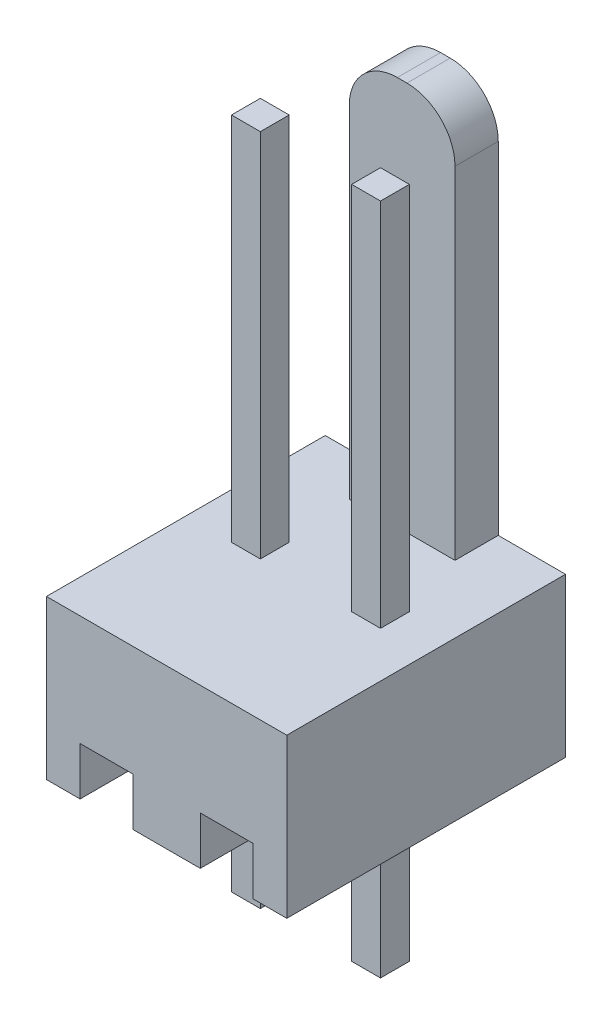
ISO-10303-21;
HEADER;
FILE_DESCRIPTION(('STEP AP214'),'2;1');
FILE_NAME('part.step','',(''),(''),'','','');
FILE_SCHEMA(('AUTOMOTIVE_DESIGN { 1 0 10303 214 1 1 1 1 }'));
ENDSEC;
DATA;
#1=APPLICATION_CONTEXT('core data for automotive mechanical design processes');
#2=APPLICATION_PROTOCOL_DEFINITION('international standard','automotive_design',2000,#1);
#3=PRODUCT_CONTEXT('',#1,'mechanical');
#4=PRODUCT('Part','Part','',(#3));
#5=PRODUCT_RELATED_PRODUCT_CATEGORY('part','',(#4));
#6=PRODUCT_DEFINITION_FORMATION('','',#4);
#7=PRODUCT_DEFINITION_CONTEXT('part definition',#1,'design');
#8=PRODUCT_DEFINITION('design','',#6,#7);
#9=PRODUCT_DEFINITION_SHAPE('','',#8);
#10=(LENGTH_UNIT() NAMED_UNIT(*) SI_UNIT(.MILLI.,.METRE.));
#11=(NAMED_UNIT(*) PLANE_ANGLE_UNIT() SI_UNIT($,.RADIAN.));
#12=(NAMED_UNIT(*) SI_UNIT($,.STERADIAN.) SOLID_ANGLE_UNIT());
#13=UNCERTAINTY_MEASURE_WITH_UNIT(LENGTH_MEASURE(1.E-05),#10,'distance_accuracy_value','');
#14=(GEOMETRIC_REPRESENTATION_CONTEXT(3) GLOBAL_UNCERTAINTY_ASSIGNED_CONTEXT((#13)) GLOBAL_UNIT_ASSIGNED_CONTEXT((#10,
#11,#12)) REPRESENTATION_CONTEXT('',''));
#15=CARTESIAN_POINT('',(0.,0.,0.));
#16=DIRECTION('',(0.,0.,1.));
#17=DIRECTION('',(1.,0.,0.));
#18=AXIS2_PLACEMENT_3D('',#15,#16,#17);
#19=CARTESIAN_POINT('',(0.0999999999999996,10.4,0.));
#20=DIRECTION('',(0.,0.,-1.));
#21=DIRECTION('',(-1.,0.,0.));
#22=AXIS2_PLACEMENT_3D('',#19,#20,#21);
#23=CYLINDRICAL_SURFACE('',#22,1.);
#24=DIRECTION('',(0.,0.,-1.));
#25=VECTOR('',#24,1.);
#26=CARTESIAN_POINT('',(0.0999999999999996,11.4,0.));
#27=LINE('',#26,#25);
#28=CARTESIAN_POINT('',(0.0999999999999996,11.4,-2.));
#29=VERTEX_POINT('',#28);
#30=CARTESIAN_POINT('',(0.0999999999999996,11.4,-2.9));
#31=VERTEX_POINT('',#30);
#32=EDGE_CURVE('E393',#29,#31,#27,.T.);
#33=ORIENTED_EDGE('',*,*,#32,.F.);
#34=CARTESIAN_POINT('',(0.0999999999999996,10.4,-2.));
#35=DIRECTION('',(0.,0.,-1.));
#36=DIRECTION('',(-1.,0.,0.));
#37=AXIS2_PLACEMENT_3D('',#34,#35,#36);
#38=CIRCLE('',#37,1.);
#39=CARTESIAN_POINT('',(1.1,10.4,-2.));
#40=VERTEX_POINT('',#39);
#41=EDGE_CURVE('E398',#40,#29,#38,.F.);
#42=ORIENTED_EDGE('',*,*,#41,.F.);
#43=DIRECTION('',(0.,0.,-1.));
#44=VECTOR('',#43,1.);
#45=CARTESIAN_POINT('',(1.1,10.4,-2.9));
#46=LINE('',#45,#44);
#47=CARTESIAN_POINT('',(1.1,10.4,-2.9));
#48=VERTEX_POINT('',#47);
#49=EDGE_CURVE('E395',#48,#40,#46,.F.);
#50=ORIENTED_EDGE('',*,*,#49,.F.);
#51=CARTESIAN_POINT('',(0.0999999999999996,10.4,-2.9));
#52=DIRECTION('',(0.,0.,1.));
#53=DIRECTION('',(1.,0.,0.));
#54=AXIS2_PLACEMENT_3D('',#51,#52,#53);
#55=CIRCLE('',#54,1.);
#56=EDGE_CURVE('E400',#31,#48,#55,.F.);
#57=ORIENTED_EDGE('',*,*,#56,.F.);
#58=EDGE_LOOP('',(#33,#42,#50,#57));
#59=FACE_BOUND('',#58,.T.);
#60=ADVANCED_FACE('F35',(#59),#23,.T.);
#61=CARTESIAN_POINT('',(-0.1,10.4,0.));
#62=DIRECTION('',(0.,0.,1.));
#63=DIRECTION('',(1.,0.,0.));
#64=AXIS2_PLACEMENT_3D('',#61,#62,#63);
#65=CYLINDRICAL_SURFACE('',#64,1.);
#66=DIRECTION('',(0.,0.,1.));
#67=VECTOR('',#66,1.);
#68=CARTESIAN_POINT('',(-0.1,11.4,0.));
#69=LINE('',#68,#67);
#70=CARTESIAN_POINT('',(-0.1,11.4,-2.9));
#71=VERTEX_POINT('',#70);
#72=CARTESIAN_POINT('',(-0.1,11.4,-2.));
#73=VERTEX_POINT('',#72);
#74=EDGE_CURVE('E387',#71,#73,#69,.T.);
#75=ORIENTED_EDGE('',*,*,#74,.F.);
#76=CARTESIAN_POINT('',(-0.1,10.4,-2.9));
#77=DIRECTION('',(0.,0.,1.));
#78=DIRECTION('',(1.,0.,0.));
#79=AXIS2_PLACEMENT_3D('',#76,#77,#78);
#80=CIRCLE('',#79,1.);
#81=CARTESIAN_POINT('',(-1.1,10.4,-2.9));
#82=VERTEX_POINT('',#81);
#83=EDGE_CURVE('E589',#82,#71,#80,.F.);
#84=ORIENTED_EDGE('',*,*,#83,.F.);
#85=DIRECTION('',(0.,0.,1.));
#86=VECTOR('',#85,1.);
#87=CARTESIAN_POINT('',(-1.1,10.4,-2.));
#88=LINE('',#87,#86);
#89=CARTESIAN_POINT('',(-1.1,10.4,-2.));
#90=VERTEX_POINT('',#89);
#91=EDGE_CURVE('E591',#90,#82,#88,.F.);
#92=ORIENTED_EDGE('',*,*,#91,.F.);
#93=CARTESIAN_POINT('',(-0.1,10.4,-2.));
#94=DIRECTION('',(0.,0.,-1.));
#95=DIRECTION('',(-1.,0.,0.));
#96=AXIS2_PLACEMENT_3D('',#93,#94,#95);
#97=CIRCLE('',#96,1.);
#98=EDGE_CURVE('E453',#73,#90,#97,.F.);
#99=ORIENTED_EDGE('',*,*,#98,.F.);
#100=EDGE_LOOP('',(#75,#84,#92,#99));
#101=FACE_BOUND('',#100,.T.);
#102=ADVANCED_FACE('F441',(#101),#65,.T.);
#103=CARTESIAN_POINT('',(0.,0.,0.));
#104=DIRECTION('',(0.,1.,0.));
#105=DIRECTION('',(0.,0.,1.));
#106=AXIS2_PLACEMENT_3D('',#103,#104,#105);
#107=PLANE('',#106);
#108=DIRECTION('',(-1.,0.,0.));
#109=VECTOR('',#108,1.);
#110=CARTESIAN_POINT('',(-2.5,0.,-2.9));
#111=LINE('',#110,#109);
#112=CARTESIAN_POINT('',(0.700000000000001,0.,-2.9));
#113=VERTEX_POINT('',#112);
#114=CARTESIAN_POINT('',(-0.699999999999999,0.,-2.9));
#115=VERTEX_POINT('',#114);
#116=EDGE_CURVE('E558',#113,#115,#111,.T.);
#117=ORIENTED_EDGE('',*,*,#116,.F.);
#118=DIRECTION('',(0.,0.,-1.));
#119=VECTOR('',#118,1.);
#120=CARTESIAN_POINT('',(0.700000000000001,0.,-2.9));
#121=LINE('',#120,#119);
#122=CARTESIAN_POINT('',(0.700000000000001,0.,2.9));
#123=VERTEX_POINT('',#122);
#124=EDGE_CURVE('E466',#123,#113,#121,.T.);
#125=ORIENTED_EDGE('',*,*,#124,.F.);
#126=DIRECTION('',(1.,0.,0.));
#127=VECTOR('',#126,1.);
#128=CARTESIAN_POINT('',(-2.5,0.,2.9));
#129=LINE('',#128,#127);
#130=CARTESIAN_POINT('',(-0.699999999999999,0.,2.9));
#131=VERTEX_POINT('',#130);
#132=EDGE_CURVE('E551',#131,#123,#129,.T.);
#133=ORIENTED_EDGE('',*,*,#132,.F.);
#134=DIRECTION('',(0.,0.,1.));
#135=VECTOR('',#134,1.);
#136=CARTESIAN_POINT('',(-0.699999999999999,0.,-2.9));
#137=LINE('',#136,#135);
#138=EDGE_CURVE('E498',#115,#131,#137,.T.);
#139=ORIENTED_EDGE('',*,*,#138,.F.);
#140=EDGE_LOOP('',(#117,#125,#133,#139));
#141=FACE_BOUND('',#140,.T.);
#142=ADVANCED_FACE('F446',(#141),#107,.F.);
#143=CARTESIAN_POINT('',(1.8,0.,2.9));
#144=VERTEX_POINT('',#143);
#145=CARTESIAN_POINT('',(2.5,0.,2.9));
#146=VERTEX_POINT('',#145);
#147=EDGE_CURVE('E552',#144,#146,#129,.T.);
#148=ORIENTED_EDGE('',*,*,#147,.F.);
#149=DIRECTION('',(0.,0.,1.));
#150=VECTOR('',#149,1.);
#151=CARTESIAN_POINT('',(1.8,0.,2.9));
#152=LINE('',#151,#150);
#153=CARTESIAN_POINT('',(1.8,0.,-2.9));
#154=VERTEX_POINT('',#153);
#155=EDGE_CURVE('E468',#154,#144,#152,.T.);
#156=ORIENTED_EDGE('',*,*,#155,.F.);
#157=CARTESIAN_POINT('',(2.5,0.,-2.9));
#158=VERTEX_POINT('',#157);
#159=EDGE_CURVE('E555',#158,#154,#111,.T.);
#160=ORIENTED_EDGE('',*,*,#159,.F.);
#161=DIRECTION('',(0.,0.,-1.));
#162=VECTOR('',#161,1.);
#163=CARTESIAN_POINT('',(2.5,0.,-2.9));
#164=LINE('',#163,#162);
#165=EDGE_CURVE('E512',#146,#158,#164,.T.);
#166=ORIENTED_EDGE('',*,*,#165,.F.);
#167=EDGE_LOOP('',(#148,#156,#160,#166));
#168=FACE_BOUND('',#167,.T.);
#169=ADVANCED_FACE('F628',(#168),#107,.F.);
#170=CARTESIAN_POINT('',(2.5,3.3,-2.9));
#171=DIRECTION('',(-1.,0.,0.));
#172=DIRECTION('',(0.,0.,1.));
#173=AXIS2_PLACEMENT_3D('',#170,#171,#172);
#174=PLANE('',#173);
#175=ORIENTED_EDGE('',*,*,#165,.T.);
#176=DIRECTION('',(0.,-1.,0.));
#177=VECTOR('',#176,1.);
#178=CARTESIAN_POINT('',(2.5,3.3,-2.9));
#179=LINE('',#178,#177);
#180=CARTESIAN_POINT('',(2.5,3.3,-2.9));
#181=VERTEX_POINT('',#180);
#182=EDGE_CURVE('E536',#181,#158,#179,.T.);
#183=ORIENTED_EDGE('',*,*,#182,.F.);
#184=DIRECTION('',(0.,0.,-1.));
#185=VECTOR('',#184,1.);
#186=CARTESIAN_POINT('',(2.5,3.3,-2.9));
#187=LINE('',#186,#185);
#188=CARTESIAN_POINT('',(2.5,3.3,2.9));
#189=VERTEX_POINT('',#188);
#190=EDGE_CURVE('E520',#189,#181,#187,.T.);
#191=ORIENTED_EDGE('',*,*,#190,.F.);
#192=DIRECTION('',(0.,-1.,0.));
#193=VECTOR('',#192,1.);
#194=CARTESIAN_POINT('',(2.5,3.3,2.9));
#195=LINE('',#194,#193);
#196=EDGE_CURVE('E545',#189,#146,#195,.T.);
#197=ORIENTED_EDGE('',*,*,#196,.T.);
#198=EDGE_LOOP('',(#175,#183,#191,#197));
#199=FACE_BOUND('',#198,.T.);
#200=ADVANCED_FACE('F582',(#199),#174,.F.);
#201=CARTESIAN_POINT('',(-2.5,3.3,-2.9));
#202=DIRECTION('',(0.,0.,1.));
#203=DIRECTION('',(1.,0.,0.));
#204=AXIS2_PLACEMENT_3D('',#201,#202,#203);
#205=PLANE('',#204);
#206=DIRECTION('',(-1.,0.,0.));
#207=VECTOR('',#206,1.);
#208=CARTESIAN_POINT('',(-1.1,11.4,-2.9));
#209=LINE('',#208,#207);
#210=EDGE_CURVE('E368',#31,#71,#209,.T.);
#211=ORIENTED_EDGE('',*,*,#210,.F.);
#212=ORIENTED_EDGE('',*,*,#56,.T.);
#213=DIRECTION('',(0.,-1.,0.));
#214=VECTOR('',#213,1.);
#215=CARTESIAN_POINT('',(1.1,11.4,-2.9));
#216=LINE('',#215,#214);
#217=CARTESIAN_POINT('',(1.1,3.3,-2.9));
#218=VERTEX_POINT('',#217);
#219=EDGE_CURVE('E390',#48,#218,#216,.T.);
#220=ORIENTED_EDGE('',*,*,#219,.T.);
#221=DIRECTION('',(-1.,0.,0.));
#222=VECTOR('',#221,1.);
#223=CARTESIAN_POINT('',(-2.5,3.3,-2.9));
#224=LINE('',#223,#222);
#225=EDGE_CURVE('E533',#181,#218,#224,.T.);
#226=ORIENTED_EDGE('',*,*,#225,.F.);
#227=ORIENTED_EDGE('',*,*,#182,.T.);
#228=ORIENTED_EDGE('',*,*,#159,.T.);
#229=DIRECTION('',(0.,-1.,0.));
#230=VECTOR('',#229,1.);
#231=CARTESIAN_POINT('',(1.8,1.,-2.9));
#232=LINE('',#231,#230);
#233=CARTESIAN_POINT('',(1.8,1.,-2.9));
#234=VERTEX_POINT('',#233);
#235=EDGE_CURVE('E490',#234,#154,#232,.T.);
#236=ORIENTED_EDGE('',*,*,#235,.F.);
#237=DIRECTION('',(1.,0.,0.));
#238=VECTOR('',#237,1.);
#239=CARTESIAN_POINT('',(1.8,1.,-2.9));
#240=LINE('',#239,#238);
#241=CARTESIAN_POINT('',(0.700000000000001,1.,-2.9));
#242=VERTEX_POINT('',#241);
#243=EDGE_CURVE('E474',#242,#234,#240,.T.);
#244=ORIENTED_EDGE('',*,*,#243,.F.);
#245=DIRECTION('',(0.,-1.,0.));
#246=VECTOR('',#245,1.);
#247=CARTESIAN_POINT('',(0.700000000000001,1.,-2.9));
#248=LINE('',#247,#246);
#249=EDGE_CURVE('E481',#242,#113,#248,.T.);
#250=ORIENTED_EDGE('',*,*,#249,.T.);
#251=ORIENTED_EDGE('',*,*,#116,.T.);
#252=DIRECTION('',(0.,-1.,0.));
#253=VECTOR('',#252,1.);
#254=CARTESIAN_POINT('',(-0.699999999999999,1.,-2.9));
#255=LINE('',#254,#253);
#256=CARTESIAN_POINT('',(-0.699999999999999,1.,-2.9));
#257=VERTEX_POINT('',#256);
#258=EDGE_CURVE('E513',#257,#115,#255,.T.);
#259=ORIENTED_EDGE('',*,*,#258,.F.);
#260=DIRECTION('',(1.,0.,0.));
#261=VECTOR('',#260,1.);
#262=CARTESIAN_POINT('',(-1.8,1.,-2.9));
#263=LINE('',#262,#261);
#264=CARTESIAN_POINT('',(-1.8,1.,-2.9));
#265=VERTEX_POINT('',#264);
#266=EDGE_CURVE('E501',#265,#257,#263,.T.);
#267=ORIENTED_EDGE('',*,*,#266,.F.);
#268=DIRECTION('',(0.,-1.,0.));
#269=VECTOR('',#268,1.);
#270=CARTESIAN_POINT('',(-1.8,1.,-2.9));
#271=LINE('',#270,#269);
#272=CARTESIAN_POINT('',(-1.8,0.,-2.9));
#273=VERTEX_POINT('',#272);
#274=EDGE_CURVE('E516',#265,#273,#271,.T.);
#275=ORIENTED_EDGE('',*,*,#274,.T.);
#276=CARTESIAN_POINT('',(-2.5,0.,-2.9));
#277=VERTEX_POINT('',#276);
#278=EDGE_CURVE('E559',#273,#277,#111,.T.);
#279=ORIENTED_EDGE('',*,*,#278,.T.);
#280=DIRECTION('',(0.,-1.,0.));
#281=VECTOR('',#280,1.);
#282=CARTESIAN_POINT('',(-2.5,3.3,-2.9));
#283=LINE('',#282,#281);
#284=CARTESIAN_POINT('',(-2.5,3.3,-2.9));
#285=VERTEX_POINT('',#284);
#286=EDGE_CURVE('E539',#285,#277,#283,.T.);
#287=ORIENTED_EDGE('',*,*,#286,.F.);
#288=CARTESIAN_POINT('',(-1.1,3.3,-2.9));
#289=VERTEX_POINT('',#288);
#290=EDGE_CURVE('E523',#289,#285,#224,.T.);
#291=ORIENTED_EDGE('',*,*,#290,.F.);
#292=DIRECTION('',(0.,-1.,0.));
#293=VECTOR('',#292,1.);
#294=CARTESIAN_POINT('',(-1.1,11.4,-2.9));
#295=LINE('',#294,#293);
#296=EDGE_CURVE('E371',#82,#289,#295,.T.);
#297=ORIENTED_EDGE('',*,*,#296,.F.);
#298=ORIENTED_EDGE('',*,*,#83,.T.);
#299=EDGE_LOOP('',(#211,#212,#220,#226,#227,#228,#236,#244,#250,#251,#259,#267,#275,#279,#287,
#291,#297,#298));
#300=FACE_BOUND('',#299,.T.);
#301=ADVANCED_FACE('F586',(#300),#205,.F.);
#302=CARTESIAN_POINT('',(-2.5,3.3,-2.9));
#303=DIRECTION('',(1.,0.,0.));
#304=DIRECTION('',(0.,0.,-1.));
#305=AXIS2_PLACEMENT_3D('',#302,#303,#304);
#306=PLANE('',#305);
#307=DIRECTION('',(0.,0.,1.));
#308=VECTOR('',#307,1.);
#309=CARTESIAN_POINT('',(-2.5,0.,-2.9));
#310=LINE('',#309,#308);
#311=CARTESIAN_POINT('',(-2.5,0.,2.9));
#312=VERTEX_POINT('',#311);
#313=EDGE_CURVE('E553',#277,#312,#310,.T.);
#314=ORIENTED_EDGE('',*,*,#313,.T.);
#315=DIRECTION('',(0.,-1.,0.));
#316=VECTOR('',#315,1.);
#317=CARTESIAN_POINT('',(-2.5,3.3,2.9));
#318=LINE('',#317,#316);
#319=CARTESIAN_POINT('',(-2.5,3.3,2.9));
#320=VERTEX_POINT('',#319);
#321=EDGE_CURVE('E542',#320,#312,#318,.T.);
#322=ORIENTED_EDGE('',*,*,#321,.F.);
#323=DIRECTION('',(0.,0.,1.));
#324=VECTOR('',#323,1.);
#325=CARTESIAN_POINT('',(-2.5,3.3,-2.9));
#326=LINE('',#325,#324);
#327=EDGE_CURVE('E527',#285,#320,#326,.T.);
#328=ORIENTED_EDGE('',*,*,#327,.F.);
#329=ORIENTED_EDGE('',*,*,#286,.T.);
#330=EDGE_LOOP('',(#314,#322,#328,#329));
#331=FACE_BOUND('',#330,.T.);
#332=ADVANCED_FACE('F571',(#331),#306,.F.);
#333=CARTESIAN_POINT('',(-2.5,3.3,2.9));
#334=DIRECTION('',(0.,0.,-1.));
#335=DIRECTION('',(-1.,0.,0.));
#336=AXIS2_PLACEMENT_3D('',#333,#334,#335);
#337=PLANE('',#336);
#338=ORIENTED_EDGE('',*,*,#132,.T.);
#339=DIRECTION('',(0.,-1.,0.));
#340=VECTOR('',#339,1.);
#341=CARTESIAN_POINT('',(0.700000000000001,1.,2.9));
#342=LINE('',#341,#340);
#343=CARTESIAN_POINT('',(0.700000000000001,1.,2.9));
#344=VERTEX_POINT('',#343);
#345=EDGE_CURVE('E484',#344,#123,#342,.T.);
#346=ORIENTED_EDGE('',*,*,#345,.F.);
#347=DIRECTION('',(-1.,0.,0.));
#348=VECTOR('',#347,1.);
#349=CARTESIAN_POINT('',(0.700000000000001,1.,2.9));
#350=LINE('',#349,#348);
#351=CARTESIAN_POINT('',(1.8,1.,2.9));
#352=VERTEX_POINT('',#351);
#353=EDGE_CURVE('E479',#352,#344,#350,.T.);
#354=ORIENTED_EDGE('',*,*,#353,.F.);
#355=DIRECTION('',(0.,-1.,0.));
#356=VECTOR('',#355,1.);
#357=CARTESIAN_POINT('',(1.8,1.,2.9));
#358=LINE('',#357,#356);
#359=EDGE_CURVE('E487',#352,#144,#358,.T.);
#360=ORIENTED_EDGE('',*,*,#359,.T.);
#361=ORIENTED_EDGE('',*,*,#147,.T.);
#362=ORIENTED_EDGE('',*,*,#196,.F.);
#363=DIRECTION('',(1.,0.,0.));
#364=VECTOR('',#363,1.);
#365=CARTESIAN_POINT('',(-2.5,3.3,2.9));
#366=LINE('',#365,#364);
#367=EDGE_CURVE('E548',#320,#189,#366,.T.);
#368=ORIENTED_EDGE('',*,*,#367,.F.);
#369=ORIENTED_EDGE('',*,*,#321,.T.);
#370=CARTESIAN_POINT('',(-1.8,0.,2.9));
#371=VERTEX_POINT('',#370);
#372=EDGE_CURVE('E524',#312,#371,#129,.T.);
#373=ORIENTED_EDGE('',*,*,#372,.T.);
#374=DIRECTION('',(0.,-1.,0.));
#375=VECTOR('',#374,1.);
#376=CARTESIAN_POINT('',(-1.8,1.,2.9));
#377=LINE('',#376,#375);
#378=CARTESIAN_POINT('',(-1.8,1.,2.9));
#379=VERTEX_POINT('',#378);
#380=EDGE_CURVE('E506',#379,#371,#377,.T.);
#381=ORIENTED_EDGE('',*,*,#380,.F.);
#382=DIRECTION('',(-1.,0.,0.));
#383=VECTOR('',#382,1.);
#384=CARTESIAN_POINT('',(-0.699999999999999,1.,2.9));
#385=LINE('',#384,#383);
#386=CARTESIAN_POINT('',(-0.699999999999999,1.,2.9));
#387=VERTEX_POINT('',#386);
#388=EDGE_CURVE('E494',#387,#379,#385,.T.);
#389=ORIENTED_EDGE('',*,*,#388,.F.);
#390=DIRECTION('',(0.,-1.,0.));
#391=VECTOR('',#390,1.);
#392=CARTESIAN_POINT('',(-0.699999999999999,1.,2.9));
#393=LINE('',#392,#391);
#394=EDGE_CURVE('E509',#387,#131,#393,.T.);
#395=ORIENTED_EDGE('',*,*,#394,.T.);
#396=EDGE_LOOP('',(#338,#346,#354,#360,#361,#362,#368,#369,#373,#381,#389,#395));
#397=FACE_BOUND('',#396,.T.);
#398=ADVANCED_FACE('F576',(#397),#337,.F.);
#399=CARTESIAN_POINT('',(0.,3.3,0.));
#400=DIRECTION('',(0.,1.,0.));
#401=DIRECTION('',(0.,0.,1.));
#402=AXIS2_PLACEMENT_3D('',#399,#400,#401);
#403=PLANE('',#402);
#404=DIRECTION('',(0.,0.,-1.));
#405=VECTOR('',#404,1.);
#406=CARTESIAN_POINT('',(-0.95,3.3,0.));
#407=LINE('',#406,#405);
#408=CARTESIAN_POINT('',(-0.95,3.3,0.));
#409=VERTEX_POINT('',#408);
#410=CARTESIAN_POINT('',(-0.949999999999999,3.3,-0.600000000000002));
#411=VERTEX_POINT('',#410);
#412=EDGE_CURVE('E310',#409,#411,#407,.T.);
#413=ORIENTED_EDGE('',*,*,#412,.F.);
#414=DIRECTION('',(1.,0.,0.));
#415=VECTOR('',#414,1.);
#416=CARTESIAN_POINT('',(0.,3.3,0.));
#417=LINE('',#416,#415);
#418=CARTESIAN_POINT('',(-1.55,3.3,0.));
#419=VERTEX_POINT('',#418);
#420=EDGE_CURVE('E296',#419,#409,#417,.T.);
#421=ORIENTED_EDGE('',*,*,#420,.F.);
#422=DIRECTION('',(0.,0.,1.));
#423=VECTOR('',#422,1.);
#424=CARTESIAN_POINT('',(-1.55,3.3,0.));
#425=LINE('',#424,#423);
#426=CARTESIAN_POINT('',(-1.55,3.3,-0.600000000000001));
#427=VERTEX_POINT('',#426);
#428=EDGE_CURVE('E54',#427,#419,#425,.T.);
#429=ORIENTED_EDGE('',*,*,#428,.F.);
#430=DIRECTION('',(-1.,0.,0.));
#431=VECTOR('',#430,1.);
#432=CARTESIAN_POINT('',(0.,3.3,-0.600000000000002));
#433=LINE('',#432,#431);
#434=EDGE_CURVE('E49',#411,#427,#433,.T.);
#435=ORIENTED_EDGE('',*,*,#434,.F.);
#436=EDGE_LOOP('',(#413,#421,#429,#435));
#437=FACE_BOUND('',#436,.T.);
#438=DIRECTION('',(0.,0.,1.));
#439=VECTOR('',#438,1.);
#440=CARTESIAN_POINT('',(0.95,3.3,0.));
#441=LINE('',#440,#439);
#442=CARTESIAN_POINT('',(0.950000000000001,3.3,-0.600000000000001));
#443=VERTEX_POINT('',#442);
#444=CARTESIAN_POINT('',(0.95,3.3,0.));
#445=VERTEX_POINT('',#444);
#446=EDGE_CURVE('E361',#443,#445,#441,.T.);
#447=ORIENTED_EDGE('',*,*,#446,.F.);
#448=DIRECTION('',(-1.,0.,0.));
#449=VECTOR('',#448,1.);
#450=CARTESIAN_POINT('',(0.,3.3,-0.600000000000002));
#451=LINE('',#450,#449);
#452=CARTESIAN_POINT('',(1.55,3.3,-0.600000000000001));
#453=VERTEX_POINT('',#452);
#454=EDGE_CURVE('E340',#453,#443,#451,.T.);
#455=ORIENTED_EDGE('',*,*,#454,.F.);
#456=DIRECTION('',(0.,0.,-1.));
#457=VECTOR('',#456,1.);
#458=CARTESIAN_POINT('',(1.55,3.3,0.));
#459=LINE('',#458,#457);
#460=CARTESIAN_POINT('',(1.55,3.3,0.));
#461=VERTEX_POINT('',#460);
#462=EDGE_CURVE('E355',#461,#453,#459,.T.);
#463=ORIENTED_EDGE('',*,*,#462,.F.);
#464=DIRECTION('',(1.,0.,0.));
#465=VECTOR('',#464,1.);
#466=CARTESIAN_POINT('',(0.,3.3,0.));
#467=LINE('',#466,#465);
#468=EDGE_CURVE('E358',#445,#461,#467,.T.);
#469=ORIENTED_EDGE('',*,*,#468,.F.);
#470=EDGE_LOOP('',(#447,#455,#463,#469));
#471=FACE_BOUND('',#470,.T.);
#472=DIRECTION('',(0.,0.,1.));
#473=VECTOR('',#472,1.);
#474=CARTESIAN_POINT('',(-1.1,3.3,-2.));
#475=LINE('',#474,#473);
#476=CARTESIAN_POINT('',(-1.1,3.3,-2.));
#477=VERTEX_POINT('',#476);
#478=EDGE_CURVE('E364',#289,#477,#475,.T.);
#479=ORIENTED_EDGE('',*,*,#478,.F.);
#480=ORIENTED_EDGE('',*,*,#290,.T.);
#481=ORIENTED_EDGE('',*,*,#327,.T.);
#482=ORIENTED_EDGE('',*,*,#367,.T.);
#483=ORIENTED_EDGE('',*,*,#190,.T.);
#484=ORIENTED_EDGE('',*,*,#225,.T.);
#485=DIRECTION('',(0.,0.,-1.));
#486=VECTOR('',#485,1.);
#487=CARTESIAN_POINT('',(1.1,3.3,-2.9));
#488=LINE('',#487,#486);
#489=CARTESIAN_POINT('',(1.1,3.3,-2.));
#490=VERTEX_POINT('',#489);
#491=EDGE_CURVE('E369',#490,#218,#488,.T.);
#492=ORIENTED_EDGE('',*,*,#491,.F.);
#493=DIRECTION('',(1.,0.,0.));
#494=VECTOR('',#493,1.);
#495=CARTESIAN_POINT('',(1.1,3.3,-2.));
#496=LINE('',#495,#494);
#497=EDGE_CURVE('E372',#477,#490,#496,.T.);
#498=ORIENTED_EDGE('',*,*,#497,.F.);
#499=EDGE_LOOP('',(#479,#480,#481,#482,#483,#484,#492,#498));
#500=FACE_BOUND('',#499,.T.);
#501=ADVANCED_FACE('F567',(#437,#471,#500),#403,.T.);
#502=ORIENTED_EDGE('',*,*,#278,.F.);
#503=DIRECTION('',(0.,0.,-1.));
#504=VECTOR('',#503,1.);
#505=CARTESIAN_POINT('',(-1.8,0.,2.9));
#506=LINE('',#505,#504);
#507=EDGE_CURVE('E486',#371,#273,#506,.T.);
#508=ORIENTED_EDGE('',*,*,#507,.F.);
#509=ORIENTED_EDGE('',*,*,#372,.F.);
#510=ORIENTED_EDGE('',*,*,#313,.F.);
#511=EDGE_LOOP('',(#502,#508,#509,#510));
#512=FACE_BOUND('',#511,.T.);
#513=ADVANCED_FACE('F599',(#512),#107,.F.);
#514=CARTESIAN_POINT('',(-0.699999999999999,1.,-2.9));
#515=DIRECTION('',(1.,0.,0.));
#516=DIRECTION('',(0.,0.,-1.));
#517=AXIS2_PLACEMENT_3D('',#514,#515,#516);
#518=PLANE('',#517);
#519=ORIENTED_EDGE('',*,*,#138,.T.);
#520=ORIENTED_EDGE('',*,*,#394,.F.);
#521=DIRECTION('',(0.,0.,1.));
#522=VECTOR('',#521,1.);
#523=CARTESIAN_POINT('',(-0.699999999999999,1.,-2.9));
#524=LINE('',#523,#522);
#525=EDGE_CURVE('E503',#257,#387,#524,.T.);
#526=ORIENTED_EDGE('',*,*,#525,.F.);
#527=ORIENTED_EDGE('',*,*,#258,.T.);
#528=EDGE_LOOP('',(#519,#520,#526,#527));
#529=FACE_BOUND('',#528,.T.);
#530=ADVANCED_FACE('F609',(#529),#518,.F.);
#531=CARTESIAN_POINT('',(-1.8,1.,2.9));
#532=DIRECTION('',(-1.,0.,0.));
#533=DIRECTION('',(0.,0.,1.));
#534=AXIS2_PLACEMENT_3D('',#531,#532,#533);
#535=PLANE('',#534);
#536=ORIENTED_EDGE('',*,*,#507,.T.);
#537=ORIENTED_EDGE('',*,*,#274,.F.);
#538=DIRECTION('',(0.,0.,-1.));
#539=VECTOR('',#538,1.);
#540=CARTESIAN_POINT('',(-1.8,1.,2.9));
#541=LINE('',#540,#539);
#542=EDGE_CURVE('E497',#379,#265,#541,.T.);
#543=ORIENTED_EDGE('',*,*,#542,.F.);
#544=ORIENTED_EDGE('',*,*,#380,.T.);
#545=EDGE_LOOP('',(#536,#537,#543,#544));
#546=FACE_BOUND('',#545,.T.);
#547=ADVANCED_FACE('F604',(#546),#535,.F.);
#548=CARTESIAN_POINT('',(0.,1.,0.));
#549=DIRECTION('',(0.,-1.,0.));
#550=DIRECTION('',(0.,0.,-1.));
#551=AXIS2_PLACEMENT_3D('',#548,#549,#550);
#552=PLANE('',#551);
#553=DIRECTION('',(0.,0.,1.));
#554=VECTOR('',#553,1.);
#555=CARTESIAN_POINT('',(-0.95,1.,0.));
#556=LINE('',#555,#554);
#557=CARTESIAN_POINT('',(-0.949999999999999,1.,-0.600000000000002));
#558=VERTEX_POINT('',#557);
#559=CARTESIAN_POINT('',(-0.95,1.,0.));
#560=VERTEX_POINT('',#559);
#561=EDGE_CURVE('E11',#558,#560,#556,.T.);
#562=ORIENTED_EDGE('',*,*,#561,.F.);
#563=DIRECTION('',(1.,0.,0.));
#564=VECTOR('',#563,1.);
#565=CARTESIAN_POINT('',(0.,1.,-0.600000000000002));
#566=LINE('',#565,#564);
#567=CARTESIAN_POINT('',(-1.55,1.,-0.600000000000001));
#568=VERTEX_POINT('',#567);
#569=EDGE_CURVE('E42',#568,#558,#566,.T.);
#570=ORIENTED_EDGE('',*,*,#569,.F.);
#571=DIRECTION('',(0.,0.,-1.));
#572=VECTOR('',#571,1.);
#573=CARTESIAN_POINT('',(-1.55,1.,0.));
#574=LINE('',#573,#572);
#575=CARTESIAN_POINT('',(-1.55,1.,0.));
#576=VERTEX_POINT('',#575);
#577=EDGE_CURVE('E416',#576,#568,#574,.T.);
#578=ORIENTED_EDGE('',*,*,#577,.F.);
#579=DIRECTION('',(-1.,0.,0.));
#580=VECTOR('',#579,1.);
#581=CARTESIAN_POINT('',(0.,1.,0.));
#582=LINE('',#581,#580);
#583=EDGE_CURVE('E414',#560,#576,#582,.T.);
#584=ORIENTED_EDGE('',*,*,#583,.F.);
#585=EDGE_LOOP('',(#562,#570,#578,#584));
#586=FACE_BOUND('',#585,.T.);
#587=ORIENTED_EDGE('',*,*,#388,.T.);
#588=ORIENTED_EDGE('',*,*,#542,.T.);
#589=ORIENTED_EDGE('',*,*,#266,.T.);
#590=ORIENTED_EDGE('',*,*,#525,.T.);
#591=EDGE_LOOP('',(#587,#588,#589,#590));
#592=FACE_BOUND('',#591,.T.);
#593=ADVANCED_FACE('F423',(#586,#592),#552,.T.);
#594=CARTESIAN_POINT('',(0.700000000000001,1.,-2.9));
#595=DIRECTION('',(-1.,0.,0.));
#596=DIRECTION('',(0.,0.,1.));
#597=AXIS2_PLACEMENT_3D('',#594,#595,#596);
#598=PLANE('',#597);
#599=ORIENTED_EDGE('',*,*,#124,.T.);
#600=ORIENTED_EDGE('',*,*,#249,.F.);
#601=DIRECTION('',(0.,0.,-1.));
#602=VECTOR('',#601,1.);
#603=CARTESIAN_POINT('',(0.700000000000001,1.,-2.9));
#604=LINE('',#603,#602);
#605=EDGE_CURVE('E471',#344,#242,#604,.T.);
#606=ORIENTED_EDGE('',*,*,#605,.F.);
#607=ORIENTED_EDGE('',*,*,#345,.T.);
#608=EDGE_LOOP('',(#599,#600,#606,#607));
#609=FACE_BOUND('',#608,.T.);
#610=ADVANCED_FACE('F619',(#609),#598,.F.);
#611=CARTESIAN_POINT('',(1.8,1.,2.9));
#612=DIRECTION('',(1.,0.,0.));
#613=DIRECTION('',(0.,0.,-1.));
#614=AXIS2_PLACEMENT_3D('',#611,#612,#613);
#615=PLANE('',#614);
#616=ORIENTED_EDGE('',*,*,#155,.T.);
#617=ORIENTED_EDGE('',*,*,#359,.F.);
#618=DIRECTION('',(0.,0.,1.));
#619=VECTOR('',#618,1.);
#620=CARTESIAN_POINT('',(1.8,1.,2.9));
#621=LINE('',#620,#619);
#622=EDGE_CURVE('E477',#234,#352,#621,.T.);
#623=ORIENTED_EDGE('',*,*,#622,.F.);
#624=ORIENTED_EDGE('',*,*,#235,.T.);
#625=EDGE_LOOP('',(#616,#617,#623,#624));
#626=FACE_BOUND('',#625,.T.);
#627=ADVANCED_FACE('F625',(#626),#615,.F.);
#628=CARTESIAN_POINT('',(0.,1.,0.));
#629=DIRECTION('',(0.,1.,0.));
#630=DIRECTION('',(0.,0.,1.));
#631=AXIS2_PLACEMENT_3D('',#628,#629,#630);
#632=PLANE('',#631);
#633=DIRECTION('',(-1.,0.,0.));
#634=VECTOR('',#633,1.);
#635=CARTESIAN_POINT('',(0.,1.,-0.600000000000002));
#636=LINE('',#635,#634);
#637=CARTESIAN_POINT('',(1.55,1.,-0.600000000000001));
#638=VERTEX_POINT('',#637);
#639=CARTESIAN_POINT('',(0.950000000000001,1.,-0.600000000000001));
#640=VERTEX_POINT('',#639);
#641=EDGE_CURVE('E402',#638,#640,#636,.T.);
#642=ORIENTED_EDGE('',*,*,#641,.T.);
#643=DIRECTION('',(0.,0.,1.));
#644=VECTOR('',#643,1.);
#645=CARTESIAN_POINT('',(0.95,1.,0.));
#646=LINE('',#645,#644);
#647=CARTESIAN_POINT('',(0.95,1.,0.));
#648=VERTEX_POINT('',#647);
#649=EDGE_CURVE('E411',#640,#648,#646,.T.);
#650=ORIENTED_EDGE('',*,*,#649,.T.);
#651=DIRECTION('',(1.,0.,0.));
#652=VECTOR('',#651,1.);
#653=CARTESIAN_POINT('',(0.,1.,0.));
#654=LINE('',#653,#652);
#655=CARTESIAN_POINT('',(1.55,1.,0.));
#656=VERTEX_POINT('',#655);
#657=EDGE_CURVE('E408',#648,#656,#654,.T.);
#658=ORIENTED_EDGE('',*,*,#657,.T.);
#659=DIRECTION('',(0.,0.,-1.));
#660=VECTOR('',#659,1.);
#661=CARTESIAN_POINT('',(1.55,1.,0.));
#662=LINE('',#661,#660);
#663=EDGE_CURVE('E405',#656,#638,#662,.T.);
#664=ORIENTED_EDGE('',*,*,#663,.T.);
#665=EDGE_LOOP('',(#642,#650,#658,#664));
#666=FACE_BOUND('',#665,.T.);
#667=ORIENTED_EDGE('',*,*,#605,.T.);
#668=ORIENTED_EDGE('',*,*,#243,.T.);
#669=ORIENTED_EDGE('',*,*,#622,.T.);
#670=ORIENTED_EDGE('',*,*,#353,.T.);
#671=EDGE_LOOP('',(#667,#668,#669,#670));
#672=FACE_BOUND('',#671,.T.);
#673=ADVANCED_FACE('F621',(#666,#672),#632,.F.);
#674=CARTESIAN_POINT('',(-1.1,11.4,-2.));
#675=DIRECTION('',(1.,0.,0.));
#676=DIRECTION('',(0.,0.,-1.));
#677=AXIS2_PLACEMENT_3D('',#674,#675,#676);
#678=PLANE('',#677);
#679=DIRECTION('',(0.,-1.,0.));
#680=VECTOR('',#679,1.);
#681=CARTESIAN_POINT('',(-1.1,11.4,-2.));
#682=LINE('',#681,#680);
#683=EDGE_CURVE('E465',#90,#477,#682,.T.);
#684=ORIENTED_EDGE('',*,*,#683,.F.);
#685=ORIENTED_EDGE('',*,*,#91,.T.);
#686=ORIENTED_EDGE('',*,*,#296,.T.);
#687=ORIENTED_EDGE('',*,*,#478,.T.);
#688=EDGE_LOOP('',(#684,#685,#686,#687));
#689=FACE_BOUND('',#688,.T.);
#690=ADVANCED_FACE('F596',(#689),#678,.F.);
#691=CARTESIAN_POINT('',(1.1,11.4,-2.));
#692=DIRECTION('',(0.,0.,-1.));
#693=DIRECTION('',(-1.,0.,0.));
#694=AXIS2_PLACEMENT_3D('',#691,#692,#693);
#695=PLANE('',#694);
#696=DIRECTION('',(0.,-1.,0.));
#697=VECTOR('',#696,1.);
#698=CARTESIAN_POINT('',(1.1,11.4,-2.));
#699=LINE('',#698,#697);
#700=EDGE_CURVE('E377',#40,#490,#699,.T.);
#701=ORIENTED_EDGE('',*,*,#700,.F.);
#702=ORIENTED_EDGE('',*,*,#41,.T.);
#703=DIRECTION('',(1.,0.,0.));
#704=VECTOR('',#703,1.);
#705=CARTESIAN_POINT('',(1.1,11.4,-2.));
#706=LINE('',#705,#704);
#707=EDGE_CURVE('E365',#73,#29,#706,.T.);
#708=ORIENTED_EDGE('',*,*,#707,.F.);
#709=ORIENTED_EDGE('',*,*,#98,.T.);
#710=ORIENTED_EDGE('',*,*,#683,.T.);
#711=ORIENTED_EDGE('',*,*,#497,.T.);
#712=EDGE_LOOP('',(#701,#702,#708,#709,#710,#711));
#713=FACE_BOUND('',#712,.T.);
#714=ADVANCED_FACE('F460',(#713),#695,.F.);
#715=CARTESIAN_POINT('',(1.1,11.4,-2.9));
#716=DIRECTION('',(-1.,0.,0.));
#717=DIRECTION('',(0.,0.,1.));
#718=AXIS2_PLACEMENT_3D('',#715,#716,#717);
#719=PLANE('',#718);
#720=ORIENTED_EDGE('',*,*,#219,.F.);
#721=ORIENTED_EDGE('',*,*,#49,.T.);
#722=ORIENTED_EDGE('',*,*,#700,.T.);
#723=ORIENTED_EDGE('',*,*,#491,.T.);
#724=EDGE_LOOP('',(#720,#721,#722,#723));
#725=FACE_BOUND('',#724,.T.);
#726=ADVANCED_FACE('F585',(#725),#719,.F.);
#727=CARTESIAN_POINT('',(0.,11.4,0.));
#728=DIRECTION('',(0.,-1.,0.));
#729=DIRECTION('',(0.,0.,-1.));
#730=AXIS2_PLACEMENT_3D('',#727,#728,#729);
#731=PLANE('',#730);
#732=ORIENTED_EDGE('',*,*,#707,.T.);
#733=ORIENTED_EDGE('',*,*,#32,.T.);
#734=ORIENTED_EDGE('',*,*,#210,.T.);
#735=ORIENTED_EDGE('',*,*,#74,.T.);
#736=EDGE_LOOP('',(#732,#733,#734,#735));
#737=FACE_BOUND('',#736,.T.);
#738=ADVANCED_FACE('F456',(#737),#731,.F.);
#739=CARTESIAN_POINT('',(0.,-3.,0.));
#740=DIRECTION('',(0.,-1.,0.));
#741=DIRECTION('',(0.,0.,-1.));
#742=AXIS2_PLACEMENT_3D('',#739,#740,#741);
#743=PLANE('',#742);
#744=DIRECTION('',(0.,0.,-1.));
#745=VECTOR('',#744,1.);
#746=CARTESIAN_POINT('',(0.950000000000001,-3.,-0.600000000000001));
#747=LINE('',#746,#745);
#748=CARTESIAN_POINT('',(0.95,-3.,0.));
#749=VERTEX_POINT('',#748);
#750=CARTESIAN_POINT('',(0.950000000000001,-3.,-0.600000000000001));
#751=VERTEX_POINT('',#750);
#752=EDGE_CURVE('E312',#749,#751,#747,.T.);
#753=ORIENTED_EDGE('',*,*,#752,.T.);
#754=DIRECTION('',(1.,0.,0.));
#755=VECTOR('',#754,1.);
#756=CARTESIAN_POINT('',(1.55,-3.,-0.600000000000001));
#757=LINE('',#756,#755);
#758=CARTESIAN_POINT('',(1.55,-3.,-0.600000000000001));
#759=VERTEX_POINT('',#758);
#760=EDGE_CURVE('E315',#751,#759,#757,.T.);
#761=ORIENTED_EDGE('',*,*,#760,.T.);
#762=DIRECTION('',(0.,0.,1.));
#763=VECTOR('',#762,1.);
#764=CARTESIAN_POINT('',(1.55,-3.,-0.600000000000001));
#765=LINE('',#764,#763);
#766=CARTESIAN_POINT('',(1.55,-3.,0.));
#767=VERTEX_POINT('',#766);
#768=EDGE_CURVE('E318',#759,#767,#765,.T.);
#769=ORIENTED_EDGE('',*,*,#768,.T.);
#770=DIRECTION('',(-1.,0.,0.));
#771=VECTOR('',#770,1.);
#772=CARTESIAN_POINT('',(1.55,-3.,0.));
#773=LINE('',#772,#771);
#774=EDGE_CURVE('E321',#767,#749,#773,.T.);
#775=ORIENTED_EDGE('',*,*,#774,.T.);
#776=EDGE_LOOP('',(#753,#761,#769,#775));
#777=FACE_BOUND('',#776,.T.);
#778=ADVANCED_FACE('F668',(#777),#743,.T.);
#779=CARTESIAN_POINT('',(1.55,11.,-0.600000000000001));
#780=DIRECTION('',(0.,0.,-1.));
#781=DIRECTION('',(-1.,0.,0.));
#782=AXIS2_PLACEMENT_3D('',#779,#780,#781);
#783=PLANE('',#782);
#784=ORIENTED_EDGE('',*,*,#641,.F.);
#785=DIRECTION('',(0.,-1.,0.));
#786=VECTOR('',#785,1.);
#787=CARTESIAN_POINT('',(1.55,11.,-0.600000000000001));
#788=LINE('',#787,#786);
#789=EDGE_CURVE('E349',#638,#759,#788,.T.);
#790=ORIENTED_EDGE('',*,*,#789,.T.);
#791=ORIENTED_EDGE('',*,*,#760,.F.);
#792=DIRECTION('',(0.,-1.,0.));
#793=VECTOR('',#792,1.);
#794=CARTESIAN_POINT('',(0.950000000000001,11.,-0.600000000000001));
#795=LINE('',#794,#793);
#796=EDGE_CURVE('E336',#640,#751,#795,.T.);
#797=ORIENTED_EDGE('',*,*,#796,.F.);
#798=EDGE_LOOP('',(#784,#790,#791,#797));
#799=FACE_BOUND('',#798,.T.);
#800=ADVANCED_FACE('F681',(#799),#783,.T.);
#801=CARTESIAN_POINT('',(1.55,11.,-0.600000000000001));
#802=DIRECTION('',(1.,0.,0.));
#803=DIRECTION('',(0.,0.,-1.));
#804=AXIS2_PLACEMENT_3D('',#801,#802,#803);
#805=PLANE('',#804);
#806=ORIENTED_EDGE('',*,*,#663,.F.);
#807=DIRECTION('',(0.,-1.,0.));
#808=VECTOR('',#807,1.);
#809=CARTESIAN_POINT('',(1.55,11.,0.));
#810=LINE('',#809,#808);
#811=EDGE_CURVE('E345',#656,#767,#810,.T.);
#812=ORIENTED_EDGE('',*,*,#811,.T.);
#813=ORIENTED_EDGE('',*,*,#768,.F.);
#814=ORIENTED_EDGE('',*,*,#789,.F.);
#815=EDGE_LOOP('',(#806,#812,#813,#814));
#816=FACE_BOUND('',#815,.T.);
#817=ADVANCED_FACE('F685',(#816),#805,.T.);
#818=CARTESIAN_POINT('',(1.55,11.,0.));
#819=DIRECTION('',(0.,0.,1.));
#820=DIRECTION('',(1.,0.,0.));
#821=AXIS2_PLACEMENT_3D('',#818,#819,#820);
#822=PLANE('',#821);
#823=ORIENTED_EDGE('',*,*,#657,.F.);
#824=DIRECTION('',(0.,-1.,0.));
#825=VECTOR('',#824,1.);
#826=CARTESIAN_POINT('',(0.95,11.,0.));
#827=LINE('',#826,#825);
#828=EDGE_CURVE('E341',#648,#749,#827,.T.);
#829=ORIENTED_EDGE('',*,*,#828,.T.);
#830=ORIENTED_EDGE('',*,*,#774,.F.);
#831=ORIENTED_EDGE('',*,*,#811,.F.);
#832=EDGE_LOOP('',(#823,#829,#830,#831));
#833=FACE_BOUND('',#832,.T.);
#834=ADVANCED_FACE('F689',(#833),#822,.T.);
#835=CARTESIAN_POINT('',(0.950000000000001,11.,-0.600000000000001));
#836=DIRECTION('',(-1.,0.,0.));
#837=DIRECTION('',(0.,0.,1.));
#838=AXIS2_PLACEMENT_3D('',#835,#836,#837);
#839=PLANE('',#838);
#840=ORIENTED_EDGE('',*,*,#649,.F.);
#841=ORIENTED_EDGE('',*,*,#796,.T.);
#842=ORIENTED_EDGE('',*,*,#752,.F.);
#843=ORIENTED_EDGE('',*,*,#828,.F.);
#844=EDGE_LOOP('',(#840,#841,#842,#843));
#845=FACE_BOUND('',#844,.T.);
#846=ADVANCED_FACE('F673',(#845),#839,.T.);
#847=CARTESIAN_POINT('',(0.950000000000001,11.,-0.600000000000001));
#848=VERTEX_POINT('',#847);
#849=EDGE_CURVE('E350',#848,#443,#795,.T.);
#850=ORIENTED_EDGE('',*,*,#849,.T.);
#851=ORIENTED_EDGE('',*,*,#446,.T.);
#852=CARTESIAN_POINT('',(0.95,11.,0.));
#853=VERTEX_POINT('',#852);
#854=EDGE_CURVE('E337',#853,#445,#827,.T.);
#855=ORIENTED_EDGE('',*,*,#854,.F.);
#856=DIRECTION('',(0.,0.,-1.));
#857=VECTOR('',#856,1.);
#858=CARTESIAN_POINT('',(0.950000000000001,11.,-0.600000000000001));
#859=LINE('',#858,#857);
#860=EDGE_CURVE('E324',#853,#848,#859,.T.);
#861=ORIENTED_EDGE('',*,*,#860,.T.);
#862=EDGE_LOOP('',(#850,#851,#855,#861));
#863=FACE_BOUND('',#862,.T.);
#864=ADVANCED_FACE('F669',(#863),#839,.T.);
#865=ORIENTED_EDGE('',*,*,#854,.T.);
#866=ORIENTED_EDGE('',*,*,#468,.T.);
#867=CARTESIAN_POINT('',(1.55,11.,0.));
#868=VERTEX_POINT('',#867);
#869=EDGE_CURVE('E342',#868,#461,#810,.T.);
#870=ORIENTED_EDGE('',*,*,#869,.F.);
#871=DIRECTION('',(-1.,0.,0.));
#872=VECTOR('',#871,1.);
#873=CARTESIAN_POINT('',(1.55,11.,0.));
#874=LINE('',#873,#872);
#875=EDGE_CURVE('E333',#868,#853,#874,.T.);
#876=ORIENTED_EDGE('',*,*,#875,.T.);
#877=EDGE_LOOP('',(#865,#866,#870,#876));
#878=FACE_BOUND('',#877,.T.);
#879=ADVANCED_FACE('F672',(#878),#822,.T.);
#880=ORIENTED_EDGE('',*,*,#869,.T.);
#881=ORIENTED_EDGE('',*,*,#462,.T.);
#882=CARTESIAN_POINT('',(1.55,11.,-0.600000000000001));
#883=VERTEX_POINT('',#882);
#884=EDGE_CURVE('E346',#883,#453,#788,.T.);
#885=ORIENTED_EDGE('',*,*,#884,.F.);
#886=DIRECTION('',(0.,0.,1.));
#887=VECTOR('',#886,1.);
#888=CARTESIAN_POINT('',(1.55,11.,-0.600000000000001));
#889=LINE('',#888,#887);
#890=EDGE_CURVE('E330',#883,#868,#889,.T.);
#891=ORIENTED_EDGE('',*,*,#890,.T.);
#892=EDGE_LOOP('',(#880,#881,#885,#891));
#893=FACE_BOUND('',#892,.T.);
#894=ADVANCED_FACE('F679',(#893),#805,.T.);
#895=ORIENTED_EDGE('',*,*,#884,.T.);
#896=ORIENTED_EDGE('',*,*,#454,.T.);
#897=ORIENTED_EDGE('',*,*,#849,.F.);
#898=DIRECTION('',(1.,0.,0.));
#899=VECTOR('',#898,1.);
#900=CARTESIAN_POINT('',(1.55,11.,-0.600000000000001));
#901=LINE('',#900,#899);
#902=EDGE_CURVE('E327',#848,#883,#901,.T.);
#903=ORIENTED_EDGE('',*,*,#902,.T.);
#904=EDGE_LOOP('',(#895,#896,#897,#903));
#905=FACE_BOUND('',#904,.T.);
#906=ADVANCED_FACE('F675',(#905),#783,.T.);
#907=CARTESIAN_POINT('',(0.,11.,0.));
#908=DIRECTION('',(0.,-1.,0.));
#909=DIRECTION('',(0.,0.,-1.));
#910=AXIS2_PLACEMENT_3D('',#907,#908,#909);
#911=PLANE('',#910);
#912=ORIENTED_EDGE('',*,*,#860,.F.);
#913=ORIENTED_EDGE('',*,*,#875,.F.);
#914=ORIENTED_EDGE('',*,*,#890,.F.);
#915=ORIENTED_EDGE('',*,*,#902,.F.);
#916=EDGE_LOOP('',(#912,#913,#914,#915));
#917=FACE_BOUND('',#916,.T.);
#918=ADVANCED_FACE('F678',(#917),#911,.F.);
#919=CARTESIAN_POINT('',(0.,-3.,0.));
#920=DIRECTION('',(0.,-1.,0.));
#921=DIRECTION('',(0.,0.,-1.));
#922=AXIS2_PLACEMENT_3D('',#919,#920,#921);
#923=PLANE('',#922);
#924=DIRECTION('',(0.,0.,1.));
#925=VECTOR('',#924,1.);
#926=CARTESIAN_POINT('',(-0.949999999999999,-3.,-0.600000000000002));
#927=LINE('',#926,#925);
#928=CARTESIAN_POINT('',(-0.949999999999999,-3.,-0.600000000000002));
#929=VERTEX_POINT('',#928);
#930=CARTESIAN_POINT('',(-0.95,-3.,0.));
#931=VERTEX_POINT('',#930);
#932=EDGE_CURVE('E258',#929,#931,#927,.T.);
#933=ORIENTED_EDGE('',*,*,#932,.T.);
#934=DIRECTION('',(-1.,0.,0.));
#935=VECTOR('',#934,1.);
#936=CARTESIAN_POINT('',(-0.95,-3.,0.));
#937=LINE('',#936,#935);
#938=CARTESIAN_POINT('',(-1.55,-3.,0.));
#939=VERTEX_POINT('',#938);
#940=EDGE_CURVE('E265',#931,#939,#937,.T.);
#941=ORIENTED_EDGE('',*,*,#940,.T.);
#942=DIRECTION('',(0.,0.,-1.));
#943=VECTOR('',#942,1.);
#944=CARTESIAN_POINT('',(-1.55,-3.,-0.600000000000001));
#945=LINE('',#944,#943);
#946=CARTESIAN_POINT('',(-1.55,-3.,-0.600000000000001));
#947=VERTEX_POINT('',#946);
#948=EDGE_CURVE('E272',#939,#947,#945,.T.);
#949=ORIENTED_EDGE('',*,*,#948,.T.);
#950=DIRECTION('',(1.,0.,0.));
#951=VECTOR('',#950,1.);
#952=CARTESIAN_POINT('',(-0.949999999999999,-3.,-0.600000000000002));
#953=LINE('',#952,#951);
#954=EDGE_CURVE('E277',#947,#929,#953,.T.);
#955=ORIENTED_EDGE('',*,*,#954,.T.);
#956=EDGE_LOOP('',(#933,#941,#949,#955));
#957=FACE_BOUND('',#956,.T.);
#958=ADVANCED_FACE('F275',(#957),#923,.T.);
#959=CARTESIAN_POINT('',(-0.95,11.,0.));
#960=DIRECTION('',(0.,0.,1.));
#961=DIRECTION('',(1.,0.,0.));
#962=AXIS2_PLACEMENT_3D('',#959,#960,#961);
#963=PLANE('',#962);
#964=DIRECTION('',(0.,-1.,0.));
#965=VECTOR('',#964,1.);
#966=CARTESIAN_POINT('',(-0.95,11.,0.));
#967=LINE('',#966,#965);
#968=EDGE_CURVE('E253',#560,#931,#967,.T.);
#969=ORIENTED_EDGE('',*,*,#968,.F.);
#970=ORIENTED_EDGE('',*,*,#583,.T.);
#971=DIRECTION('',(0.,-1.,0.));
#972=VECTOR('',#971,1.);
#973=CARTESIAN_POINT('',(-1.55,11.,0.));
#974=LINE('',#973,#972);
#975=EDGE_CURVE('E268',#576,#939,#974,.T.);
#976=ORIENTED_EDGE('',*,*,#975,.T.);
#977=ORIENTED_EDGE('',*,*,#940,.F.);
#978=EDGE_LOOP('',(#969,#970,#976,#977));
#979=FACE_BOUND('',#978,.T.);
#980=ADVANCED_FACE('F266',(#979),#963,.T.);
#981=CARTESIAN_POINT('',(-1.55,11.,-0.600000000000001));
#982=DIRECTION('',(-1.,0.,0.));
#983=DIRECTION('',(0.,0.,1.));
#984=AXIS2_PLACEMENT_3D('',#981,#982,#983);
#985=PLANE('',#984);
#986=ORIENTED_EDGE('',*,*,#975,.F.);
#987=ORIENTED_EDGE('',*,*,#577,.T.);
#988=DIRECTION('',(0.,-1.,0.));
#989=VECTOR('',#988,1.);
#990=CARTESIAN_POINT('',(-1.55,11.,-0.600000000000001));
#991=LINE('',#990,#989);
#992=EDGE_CURVE('E301',#568,#947,#991,.T.);
#993=ORIENTED_EDGE('',*,*,#992,.T.);
#994=ORIENTED_EDGE('',*,*,#948,.F.);
#995=EDGE_LOOP('',(#986,#987,#993,#994));
#996=FACE_BOUND('',#995,.T.);
#997=ADVANCED_FACE('F426',(#996),#985,.T.);
#998=CARTESIAN_POINT('',(-0.949999999999999,11.,-0.600000000000002));
#999=DIRECTION('',(0.,0.,-1.));
#1000=DIRECTION('',(-1.,0.,0.));
#1001=AXIS2_PLACEMENT_3D('',#998,#999,#1000);
#1002=PLANE('',#1001);
#1003=ORIENTED_EDGE('',*,*,#992,.F.);
#1004=ORIENTED_EDGE('',*,*,#569,.T.);
#1005=DIRECTION('',(0.,-1.,0.));
#1006=VECTOR('',#1005,1.);
#1007=CARTESIAN_POINT('',(-0.949999999999999,11.,-0.600000000000002));
#1008=LINE('',#1007,#1006);
#1009=EDGE_CURVE('E297',#558,#929,#1008,.T.);
#1010=ORIENTED_EDGE('',*,*,#1009,.T.);
#1011=ORIENTED_EDGE('',*,*,#954,.F.);
#1012=EDGE_LOOP('',(#1003,#1004,#1010,#1011));
#1013=FACE_BOUND('',#1012,.T.);
#1014=ADVANCED_FACE('F421',(#1013),#1002,.T.);
#1015=CARTESIAN_POINT('',(-0.949999999999999,11.,-0.600000000000002));
#1016=DIRECTION('',(1.,0.,0.));
#1017=DIRECTION('',(0.,0.,-1.));
#1018=AXIS2_PLACEMENT_3D('',#1015,#1016,#1017);
#1019=PLANE('',#1018);
#1020=ORIENTED_EDGE('',*,*,#1009,.F.);
#1021=ORIENTED_EDGE('',*,*,#561,.T.);
#1022=ORIENTED_EDGE('',*,*,#968,.T.);
#1023=ORIENTED_EDGE('',*,*,#932,.F.);
#1024=EDGE_LOOP('',(#1020,#1021,#1022,#1023));
#1025=FACE_BOUND('',#1024,.T.);
#1026=ADVANCED_FACE('F256',(#1025),#1019,.T.);
#1027=CARTESIAN_POINT('',(-0.95,11.,0.));
#1028=VERTEX_POINT('',#1027);
#1029=EDGE_CURVE('E261',#1028,#409,#967,.T.);
#1030=ORIENTED_EDGE('',*,*,#1029,.T.);
#1031=ORIENTED_EDGE('',*,*,#412,.T.);
#1032=CARTESIAN_POINT('',(-0.949999999999999,11.,-0.600000000000002));
#1033=VERTEX_POINT('',#1032);
#1034=EDGE_CURVE('E293',#1033,#411,#1008,.T.);
#1035=ORIENTED_EDGE('',*,*,#1034,.F.);
#1036=DIRECTION('',(0.,0.,1.));
#1037=VECTOR('',#1036,1.);
#1038=CARTESIAN_POINT('',(-0.949999999999999,11.,-0.600000000000002));
#1039=LINE('',#1038,#1037);
#1040=EDGE_CURVE('E282',#1033,#1028,#1039,.T.);
#1041=ORIENTED_EDGE('',*,*,#1040,.T.);
#1042=EDGE_LOOP('',(#1030,#1031,#1035,#1041));
#1043=FACE_BOUND('',#1042,.T.);
#1044=ADVANCED_FACE('F697',(#1043),#1019,.T.);
#1045=ORIENTED_EDGE('',*,*,#1034,.T.);
#1046=ORIENTED_EDGE('',*,*,#434,.T.);
#1047=CARTESIAN_POINT('',(-1.55,11.,-0.600000000000001));
#1048=VERTEX_POINT('',#1047);
#1049=EDGE_CURVE('E298',#1048,#427,#991,.T.);
#1050=ORIENTED_EDGE('',*,*,#1049,.F.);
#1051=DIRECTION('',(1.,0.,0.));
#1052=VECTOR('',#1051,1.);
#1053=CARTESIAN_POINT('',(-0.949999999999999,11.,-0.600000000000002));
#1054=LINE('',#1053,#1052);
#1055=EDGE_CURVE('E262',#1048,#1033,#1054,.T.);
#1056=ORIENTED_EDGE('',*,*,#1055,.T.);
#1057=EDGE_LOOP('',(#1045,#1046,#1050,#1056));
#1058=FACE_BOUND('',#1057,.T.);
#1059=ADVANCED_FACE('F435',(#1058),#1002,.T.);
#1060=ORIENTED_EDGE('',*,*,#1049,.T.);
#1061=ORIENTED_EDGE('',*,*,#428,.T.);
#1062=CARTESIAN_POINT('',(-1.55,11.,0.));
#1063=VERTEX_POINT('',#1062);
#1064=EDGE_CURVE('E302',#1063,#419,#974,.T.);
#1065=ORIENTED_EDGE('',*,*,#1064,.F.);
#1066=DIRECTION('',(0.,0.,-1.));
#1067=VECTOR('',#1066,1.);
#1068=CARTESIAN_POINT('',(-1.55,11.,-0.600000000000001));
#1069=LINE('',#1068,#1067);
#1070=EDGE_CURVE('E288',#1063,#1048,#1069,.T.);
#1071=ORIENTED_EDGE('',*,*,#1070,.T.);
#1072=EDGE_LOOP('',(#1060,#1061,#1065,#1071));
#1073=FACE_BOUND('',#1072,.T.);
#1074=ADVANCED_FACE('F429',(#1073),#985,.T.);
#1075=ORIENTED_EDGE('',*,*,#1064,.T.);
#1076=ORIENTED_EDGE('',*,*,#420,.T.);
#1077=ORIENTED_EDGE('',*,*,#1029,.F.);
#1078=DIRECTION('',(-1.,0.,0.));
#1079=VECTOR('',#1078,1.);
#1080=CARTESIAN_POINT('',(-0.95,11.,0.));
#1081=LINE('',#1080,#1079);
#1082=EDGE_CURVE('E285',#1028,#1063,#1081,.T.);
#1083=ORIENTED_EDGE('',*,*,#1082,.T.);
#1084=EDGE_LOOP('',(#1075,#1076,#1077,#1083));
#1085=FACE_BOUND('',#1084,.T.);
#1086=ADVANCED_FACE('F437',(#1085),#963,.T.);
#1087=CARTESIAN_POINT('',(0.,11.,0.));
#1088=DIRECTION('',(0.,-1.,0.));
#1089=DIRECTION('',(0.,0.,-1.));
#1090=AXIS2_PLACEMENT_3D('',#1087,#1088,#1089);
#1091=PLANE('',#1090);
#1092=ORIENTED_EDGE('',*,*,#1040,.F.);
#1093=ORIENTED_EDGE('',*,*,#1055,.F.);
#1094=ORIENTED_EDGE('',*,*,#1070,.F.);
#1095=ORIENTED_EDGE('',*,*,#1082,.F.);
#1096=EDGE_LOOP('',(#1092,#1093,#1094,#1095));
#1097=FACE_BOUND('',#1096,.T.);
#1098=ADVANCED_FACE('F711',(#1097),#1091,.F.);
#1099=CLOSED_SHELL('',(#60,#102,#142,#169,#200,#301,#332,#398,#501,#513,#530,#547,#593,#610,
#627,#673,#690,#714,#726,#738,#778,#800,#817,#834,#846,#864,#879,#894,#906,#918,#958,#980,#997,
#1014,#1026,#1044,#1059,#1074,#1086,#1098));
#1100=MANIFOLD_SOLID_BREP('B2',#1099);
#1101=ADVANCED_BREP_SHAPE_REPRESENTATION('',(#18,#1100),#14);
#1102=SHAPE_DEFINITION_REPRESENTATION(#9,#1101);
ENDSEC;
END-ISO-10303-21;
